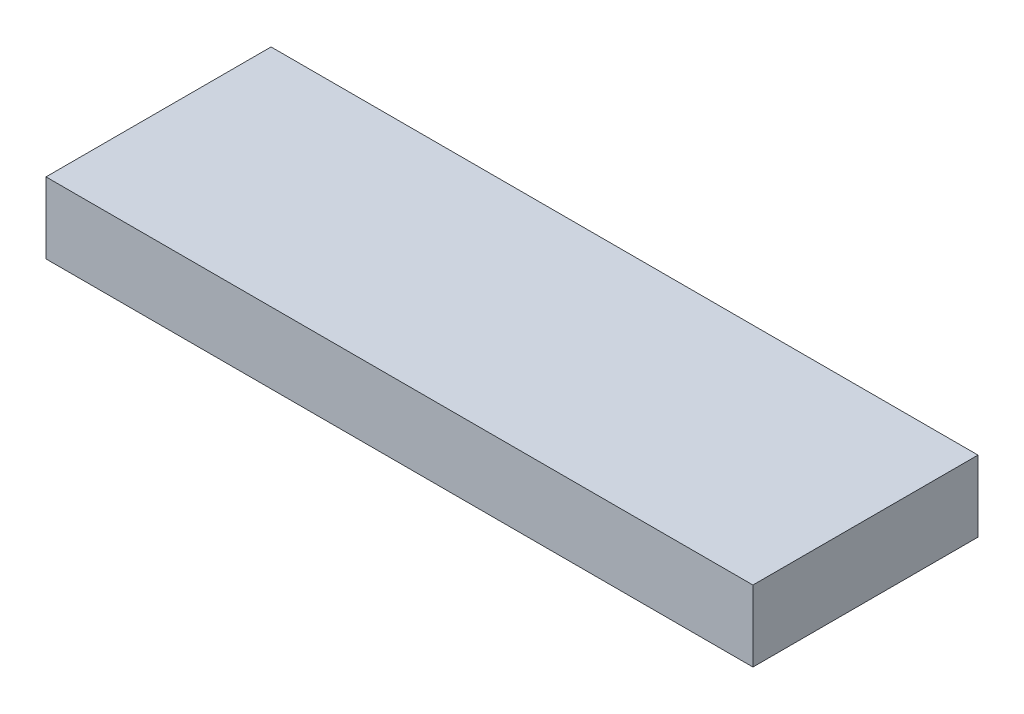
ISO-10303-21;
HEADER;
FILE_DESCRIPTION(('STEP AP214'),'2;1');
FILE_NAME('part.step','',(''),(''),'','','');
FILE_SCHEMA(('AUTOMOTIVE_DESIGN { 1 0 10303 214 1 1 1 1 }'));
ENDSEC;
DATA;
#1=APPLICATION_CONTEXT('core data for automotive mechanical design processes');
#2=APPLICATION_PROTOCOL_DEFINITION('international standard','automotive_design',2000,#1);
#3=PRODUCT_CONTEXT('',#1,'mechanical');
#4=PRODUCT('Part','Part','',(#3));
#5=PRODUCT_RELATED_PRODUCT_CATEGORY('part','',(#4));
#6=PRODUCT_DEFINITION_FORMATION('','',#4);
#7=PRODUCT_DEFINITION_CONTEXT('part definition',#1,'design');
#8=PRODUCT_DEFINITION('design','',#6,#7);
#9=PRODUCT_DEFINITION_SHAPE('','',#8);
#10=(LENGTH_UNIT() NAMED_UNIT(*) SI_UNIT(.MILLI.,.METRE.));
#11=(NAMED_UNIT(*) PLANE_ANGLE_UNIT() SI_UNIT($,.RADIAN.));
#12=(NAMED_UNIT(*) SI_UNIT($,.STERADIAN.) SOLID_ANGLE_UNIT());
#13=UNCERTAINTY_MEASURE_WITH_UNIT(LENGTH_MEASURE(1.E-05),#10,'distance_accuracy_value','');
#14=(GEOMETRIC_REPRESENTATION_CONTEXT(3) GLOBAL_UNCERTAINTY_ASSIGNED_CONTEXT((#13)) GLOBAL_UNIT_ASSIGNED_CONTEXT((#10,
#11,#12)) REPRESENTATION_CONTEXT('',''));
#15=CARTESIAN_POINT('',(0.,0.,0.));
#16=DIRECTION('',(0.,0.,1.));
#17=DIRECTION('',(1.,0.,0.));
#18=AXIS2_PLACEMENT_3D('',#15,#16,#17);
#19=CARTESIAN_POINT('',(0.,0.,0.));
#20=DIRECTION('',(0.,0.,1.));
#21=DIRECTION('',(1.,0.,0.));
#22=AXIS2_PLACEMENT_3D('',#19,#20,#21);
#23=PLANE('',#22);
#24=DIRECTION('',(0.,-1.,0.));
#25=VECTOR('',#24,1.);
#26=CARTESIAN_POINT('',(133.861233663559,0.,0.));
#27=LINE('',#26,#25);
#28=CARTESIAN_POINT('',(133.861233663559,0.,0.));
#29=VERTEX_POINT('',#28);
#30=CARTESIAN_POINT('',(133.861233663559,-19.05,0.));
#31=VERTEX_POINT('',#30);
#32=EDGE_CURVE('E83',#29,#31,#27,.T.);
#33=ORIENTED_EDGE('',*,*,#32,.F.);
#34=DIRECTION('',(-1.,0.,0.));
#35=VECTOR('',#34,1.);
#36=CARTESIAN_POINT('',(133.861233663559,0.,0.));
#37=LINE('',#36,#35);
#38=CARTESIAN_POINT('',(323.338766336441,0.,0.));
#39=VERTEX_POINT('',#38);
#40=EDGE_CURVE('E94',#39,#29,#37,.T.);
#41=ORIENTED_EDGE('',*,*,#40,.F.);
#42=DIRECTION('',(0.,1.,0.));
#43=VECTOR('',#42,1.);
#44=CARTESIAN_POINT('',(323.338766336441,0.,0.));
#45=LINE('',#44,#43);
#46=CARTESIAN_POINT('',(323.338766336441,-19.05,0.));
#47=VERTEX_POINT('',#46);
#48=EDGE_CURVE('E85',#47,#39,#45,.T.);
#49=ORIENTED_EDGE('',*,*,#48,.F.);
#50=DIRECTION('',(1.,0.,0.));
#51=VECTOR('',#50,1.);
#52=CARTESIAN_POINT('',(133.861233663559,-19.05,0.));
#53=LINE('',#52,#51);
#54=EDGE_CURVE('E75',#31,#47,#53,.T.);
#55=ORIENTED_EDGE('',*,*,#54,.F.);
#56=EDGE_LOOP('',(#33,#41,#49,#55));
#57=FACE_BOUND('',#56,.T.);
#58=ADVANCED_FACE('F33',(#57),#23,.F.);
#59=CARTESIAN_POINT('',(133.861233663559,0.,250.757764743368));
#60=DIRECTION('',(0.,-1.,0.));
#61=DIRECTION('',(0.,0.,-1.));
#62=AXIS2_PLACEMENT_3D('',#59,#60,#61);
#63=PLANE('',#62);
#64=DIRECTION('',(0.,0.,-1.));
#65=VECTOR('',#64,1.);
#66=CARTESIAN_POINT('',(133.861233663559,0.,250.757764743368));
#67=LINE('',#66,#65);
#68=CARTESIAN_POINT('',(133.861233663559,0.,60.325));
#69=VERTEX_POINT('',#68);
#70=EDGE_CURVE('E88',#69,#29,#67,.T.);
#71=ORIENTED_EDGE('',*,*,#70,.F.);
#72=DIRECTION('',(1.,0.,0.));
#73=VECTOR('',#72,1.);
#74=CARTESIAN_POINT('',(133.861233663559,0.,60.325));
#75=LINE('',#74,#73);
#76=CARTESIAN_POINT('',(323.338766336441,0.,60.325));
#77=VERTEX_POINT('',#76);
#78=EDGE_CURVE('E37',#69,#77,#75,.T.);
#79=ORIENTED_EDGE('',*,*,#78,.T.);
#80=DIRECTION('',(0.,0.,-1.));
#81=VECTOR('',#80,1.);
#82=CARTESIAN_POINT('',(323.338766336441,0.,250.757764743368));
#83=LINE('',#82,#81);
#84=EDGE_CURVE('E97',#77,#39,#83,.T.);
#85=ORIENTED_EDGE('',*,*,#84,.T.);
#86=ORIENTED_EDGE('',*,*,#40,.T.);
#87=EDGE_LOOP('',(#71,#79,#85,#86));
#88=FACE_BOUND('',#87,.T.);
#89=ADVANCED_FACE('F106',(#88),#63,.F.);
#90=CARTESIAN_POINT('',(323.338766336441,0.,250.757764743368));
#91=DIRECTION('',(-1.,0.,0.));
#92=DIRECTION('',(0.,0.,1.));
#93=AXIS2_PLACEMENT_3D('',#90,#91,#92);
#94=PLANE('',#93);
#95=ORIENTED_EDGE('',*,*,#84,.F.);
#96=DIRECTION('',(0.,-1.,0.));
#97=VECTOR('',#96,1.);
#98=CARTESIAN_POINT('',(323.338766336441,0.,60.325));
#99=LINE('',#98,#97);
#100=CARTESIAN_POINT('',(323.338766336441,-19.05,60.325));
#101=VERTEX_POINT('',#100);
#102=EDGE_CURVE('E103',#77,#101,#99,.T.);
#103=ORIENTED_EDGE('',*,*,#102,.T.);
#104=DIRECTION('',(0.,0.,-1.));
#105=VECTOR('',#104,1.);
#106=CARTESIAN_POINT('',(323.338766336441,-19.05,250.757764743368));
#107=LINE('',#106,#105);
#108=EDGE_CURVE('E79',#101,#47,#107,.T.);
#109=ORIENTED_EDGE('',*,*,#108,.T.);
#110=ORIENTED_EDGE('',*,*,#48,.T.);
#111=EDGE_LOOP('',(#95,#103,#109,#110));
#112=FACE_BOUND('',#111,.T.);
#113=ADVANCED_FACE('F102',(#112),#94,.F.);
#114=CARTESIAN_POINT('',(133.861233663559,-19.05,250.757764743368));
#115=DIRECTION('',(0.,1.,0.));
#116=DIRECTION('',(-1.,0.,0.));
#117=AXIS2_PLACEMENT_3D('',#114,#115,#116);
#118=PLANE('',#117);
#119=ORIENTED_EDGE('',*,*,#108,.F.);
#120=DIRECTION('',(-1.,0.,0.));
#121=VECTOR('',#120,1.);
#122=CARTESIAN_POINT('',(133.861233663559,-19.05,60.325));
#123=LINE('',#122,#121);
#124=CARTESIAN_POINT('',(133.861233663559,-19.05,60.325));
#125=VERTEX_POINT('',#124);
#126=EDGE_CURVE('E42',#101,#125,#123,.T.);
#127=ORIENTED_EDGE('',*,*,#126,.T.);
#128=DIRECTION('',(0.,0.,-1.));
#129=VECTOR('',#128,1.);
#130=CARTESIAN_POINT('',(133.861233663559,-19.05,250.757764743368));
#131=LINE('',#130,#129);
#132=EDGE_CURVE('E72',#125,#31,#131,.T.);
#133=ORIENTED_EDGE('',*,*,#132,.T.);
#134=ORIENTED_EDGE('',*,*,#54,.T.);
#135=EDGE_LOOP('',(#119,#127,#133,#134));
#136=FACE_BOUND('',#135,.T.);
#137=ADVANCED_FACE('F74',(#136),#118,.F.);
#138=CARTESIAN_POINT('',(133.861233663559,0.,250.757764743368));
#139=DIRECTION('',(1.,0.,0.));
#140=DIRECTION('',(0.,0.,-1.));
#141=AXIS2_PLACEMENT_3D('',#138,#139,#140);
#142=PLANE('',#141);
#143=ORIENTED_EDGE('',*,*,#132,.F.);
#144=DIRECTION('',(0.,1.,0.));
#145=VECTOR('',#144,1.);
#146=CARTESIAN_POINT('',(133.861233663559,0.,60.325));
#147=LINE('',#146,#145);
#148=EDGE_CURVE('E11',#125,#69,#147,.T.);
#149=ORIENTED_EDGE('',*,*,#148,.T.);
#150=ORIENTED_EDGE('',*,*,#70,.T.);
#151=ORIENTED_EDGE('',*,*,#32,.T.);
#152=EDGE_LOOP('',(#143,#149,#150,#151));
#153=FACE_BOUND('',#152,.T.);
#154=ADVANCED_FACE('F35',(#153),#142,.F.);
#155=CARTESIAN_POINT('',(-209.037766336441,1.77870250412711E-12,60.325));
#156=DIRECTION('',(0.,0.,-1.));
#157=DIRECTION('',(0.,1.,0.));
#158=AXIS2_PLACEMENT_3D('',#155,#156,#157);
#159=PLANE('',#158);
#160=ORIENTED_EDGE('',*,*,#126,.F.);
#161=ORIENTED_EDGE('',*,*,#102,.F.);
#162=ORIENTED_EDGE('',*,*,#78,.F.);
#163=ORIENTED_EDGE('',*,*,#148,.F.);
#164=EDGE_LOOP('',(#160,#161,#162,#163));
#165=FACE_BOUND('',#164,.T.);
#166=ADVANCED_FACE('F120',(#165),#159,.F.);
#167=CLOSED_SHELL('',(#58,#89,#113,#137,#154,#166));
#168=MANIFOLD_SOLID_BREP('B2',#167);
#169=ADVANCED_BREP_SHAPE_REPRESENTATION('',(#18,#168),#14);
#170=SHAPE_DEFINITION_REPRESENTATION(#9,#169);
ENDSEC;
END-ISO-10303-21;
